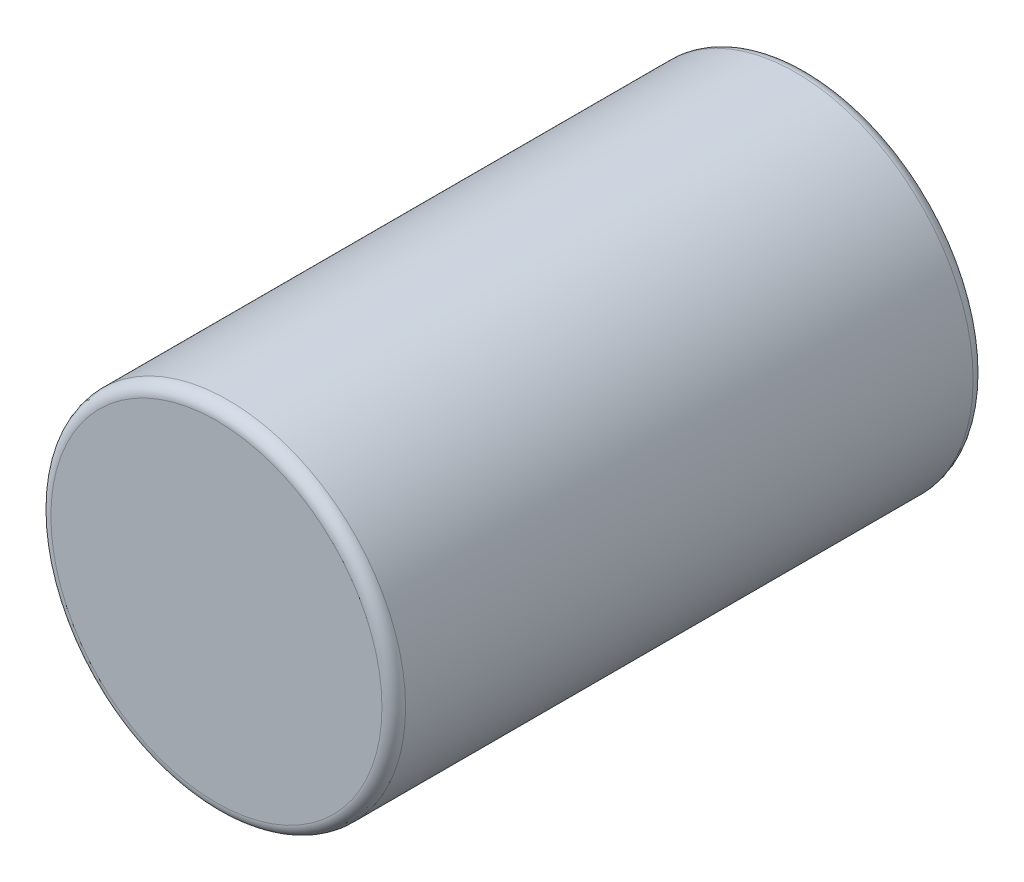
ISO-10303-21;
HEADER;
FILE_DESCRIPTION(('STEP AP214'),'2;1');
FILE_NAME('part.step','',(''),(''),'','','');
FILE_SCHEMA(('AUTOMOTIVE_DESIGN { 1 0 10303 214 1 1 1 1 }'));
ENDSEC;
DATA;
#1=APPLICATION_CONTEXT('core data for automotive mechanical design processes');
#2=APPLICATION_PROTOCOL_DEFINITION('international standard','automotive_design',2000,#1);
#3=PRODUCT_CONTEXT('',#1,'mechanical');
#4=PRODUCT('Part','Part','',(#3));
#5=PRODUCT_RELATED_PRODUCT_CATEGORY('part','',(#4));
#6=PRODUCT_DEFINITION_FORMATION('','',#4);
#7=PRODUCT_DEFINITION_CONTEXT('part definition',#1,'design');
#8=PRODUCT_DEFINITION('design','',#6,#7);
#9=PRODUCT_DEFINITION_SHAPE('','',#8);
#10=(LENGTH_UNIT() NAMED_UNIT(*) SI_UNIT(.MILLI.,.METRE.));
#11=(NAMED_UNIT(*) PLANE_ANGLE_UNIT() SI_UNIT($,.RADIAN.));
#12=(NAMED_UNIT(*) SI_UNIT($,.STERADIAN.) SOLID_ANGLE_UNIT());
#13=UNCERTAINTY_MEASURE_WITH_UNIT(LENGTH_MEASURE(1.E-05),#10,'distance_accuracy_value','');
#14=(GEOMETRIC_REPRESENTATION_CONTEXT(3) GLOBAL_UNCERTAINTY_ASSIGNED_CONTEXT((#13)) GLOBAL_UNIT_ASSIGNED_CONTEXT((#10,
#11,#12)) REPRESENTATION_CONTEXT('',''));
#15=CARTESIAN_POINT('',(0.,0.,0.));
#16=DIRECTION('',(0.,0.,1.));
#17=DIRECTION('',(1.,0.,0.));
#18=AXIS2_PLACEMENT_3D('',#15,#16,#17);
#19=CARTESIAN_POINT('',(0.,0.,10.));
#20=DIRECTION('',(0.,0.,-1.));
#21=DIRECTION('',(-1.,0.,0.));
#22=AXIS2_PLACEMENT_3D('',#19,#20,#21);
#23=CYLINDRICAL_SURFACE('',#22,3.);
#24=CARTESIAN_POINT('',(0.,0.,0.200000000000001));
#25=DIRECTION('',(0.,0.,1.));
#26=DIRECTION('',(1.,0.,0.));
#27=AXIS2_PLACEMENT_3D('',#24,#25,#26);
#28=CIRCLE('',#27,3.);
#29=CARTESIAN_POINT('',(3.,0.,0.200000000000001));
#30=VERTEX_POINT('',#29);
#31=EDGE_CURVE('E50',#30,#30,#28,.T.);
#32=ORIENTED_EDGE('',*,*,#31,.T.);
#33=EDGE_LOOP('',(#32));
#34=FACE_BOUND('',#33,.T.);
#35=CARTESIAN_POINT('',(0.,0.,9.8));
#36=DIRECTION('',(0.,0.,1.));
#37=DIRECTION('',(1.,0.,0.));
#38=AXIS2_PLACEMENT_3D('',#35,#36,#37);
#39=CIRCLE('',#38,3.);
#40=CARTESIAN_POINT('',(3.,0.,9.8));
#41=VERTEX_POINT('',#40);
#42=EDGE_CURVE('E55',#41,#41,#39,.F.);
#43=ORIENTED_EDGE('',*,*,#42,.T.);
#44=EDGE_LOOP('',(#43));
#45=FACE_BOUND('',#44,.T.);
#46=ADVANCED_FACE('F37',(#34,#45),#23,.T.);
#47=CARTESIAN_POINT('',(0.,0.,10.));
#48=DIRECTION('',(0.,0.,1.));
#49=DIRECTION('',(1.,0.,0.));
#50=AXIS2_PLACEMENT_3D('',#47,#48,#49);
#51=PLANE('',#50);
#52=CARTESIAN_POINT('',(0.,0.,10.));
#53=DIRECTION('',(0.,0.,1.));
#54=DIRECTION('',(1.,0.,0.));
#55=AXIS2_PLACEMENT_3D('',#52,#53,#54);
#56=CIRCLE('',#55,2.8);
#57=CARTESIAN_POINT('',(2.8,0.,10.));
#58=VERTEX_POINT('',#57);
#59=EDGE_CURVE('E10',#58,#58,#56,.T.);
#60=ORIENTED_EDGE('',*,*,#59,.T.);
#61=EDGE_LOOP('',(#60));
#62=FACE_BOUND('',#61,.T.);
#63=ADVANCED_FACE('F72',(#62),#51,.T.);
#64=CARTESIAN_POINT('',(0.,0.,0.));
#65=DIRECTION('',(0.,0.,1.));
#66=DIRECTION('',(1.,0.,0.));
#67=AXIS2_PLACEMENT_3D('',#64,#65,#66);
#68=PLANE('',#67);
#69=CARTESIAN_POINT('',(0.,0.,0.));
#70=DIRECTION('',(0.,0.,1.));
#71=DIRECTION('',(1.,0.,0.));
#72=AXIS2_PLACEMENT_3D('',#69,#70,#71);
#73=CIRCLE('',#72,2.8);
#74=CARTESIAN_POINT('',(2.8,0.,0.));
#75=VERTEX_POINT('',#74);
#76=EDGE_CURVE('E45',#75,#75,#73,.F.);
#77=ORIENTED_EDGE('',*,*,#76,.T.);
#78=EDGE_LOOP('',(#77));
#79=FACE_BOUND('',#78,.T.);
#80=ADVANCED_FACE('F69',(#79),#68,.F.);
#81=CARTESIAN_POINT('',(0.,0.,0.200000000000001));
#82=DIRECTION('',(0.,0.,1.));
#83=DIRECTION('',(1.,0.,0.));
#84=AXIS2_PLACEMENT_3D('',#81,#82,#83);
#85=TOROIDAL_SURFACE('',#84,2.8,0.2);
#86=ORIENTED_EDGE('',*,*,#76,.F.);
#87=EDGE_LOOP('',(#86));
#88=FACE_BOUND('',#87,.T.);
#89=ORIENTED_EDGE('',*,*,#31,.F.);
#90=EDGE_LOOP('',(#89));
#91=FACE_BOUND('',#90,.T.);
#92=ADVANCED_FACE('F65',(#88,#91),#85,.T.);
#93=CARTESIAN_POINT('',(0.,0.,9.8));
#94=DIRECTION('',(0.,0.,1.));
#95=DIRECTION('',(1.,0.,0.));
#96=AXIS2_PLACEMENT_3D('',#93,#94,#95);
#97=TOROIDAL_SURFACE('',#96,2.8,0.2);
#98=ORIENTED_EDGE('',*,*,#42,.F.);
#99=EDGE_LOOP('',(#98));
#100=FACE_BOUND('',#99,.T.);
#101=ORIENTED_EDGE('',*,*,#59,.F.);
#102=EDGE_LOOP('',(#101));
#103=FACE_BOUND('',#102,.T.);
#104=ADVANCED_FACE('F39',(#100,#103),#97,.T.);
#105=CLOSED_SHELL('',(#46,#63,#80,#92,#104));
#106=MANIFOLD_SOLID_BREP('B2',#105);
#107=ADVANCED_BREP_SHAPE_REPRESENTATION('',(#18,#106),#14);
#108=SHAPE_DEFINITION_REPRESENTATION(#9,#107);
ENDSEC;
END-ISO-10303-21;
